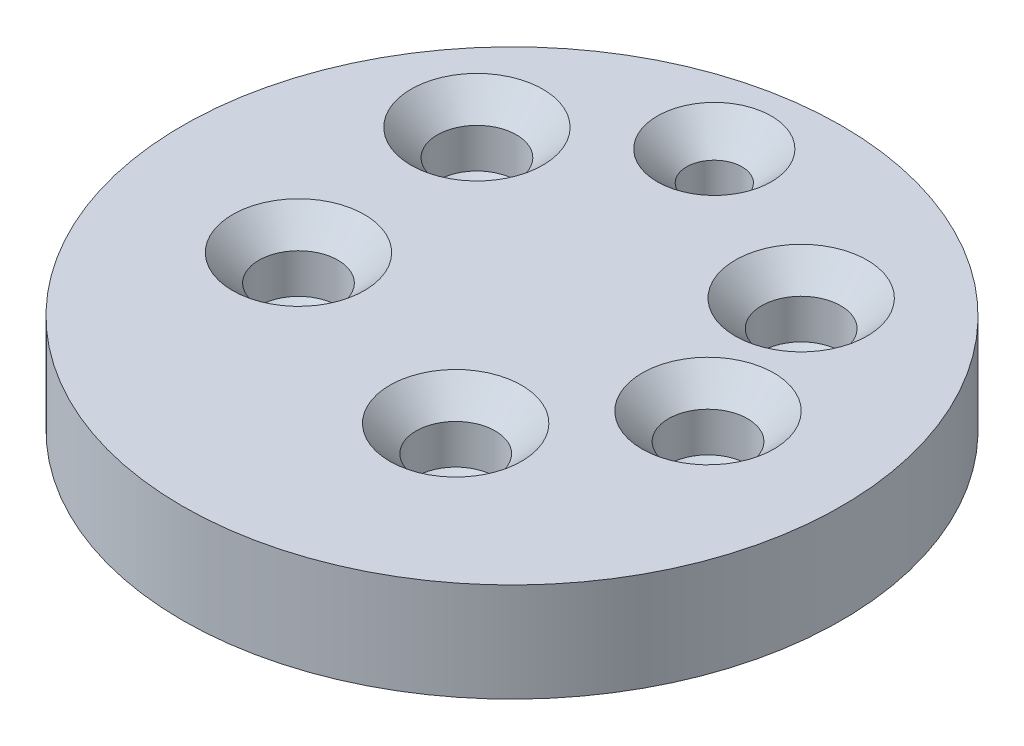
ISO-10303-21;
HEADER;
FILE_DESCRIPTION(('STEP AP214'),'2;1');
FILE_NAME('part.step','',(''),(''),'','','');
FILE_SCHEMA(('AUTOMOTIVE_DESIGN { 1 0 10303 214 1 1 1 1 }'));
ENDSEC;
DATA;
#1=APPLICATION_CONTEXT('core data for automotive mechanical design processes');
#2=APPLICATION_PROTOCOL_DEFINITION('international standard','automotive_design',2000,#1);
#3=PRODUCT_CONTEXT('',#1,'mechanical');
#4=PRODUCT('Part','Part','',(#3));
#5=PRODUCT_RELATED_PRODUCT_CATEGORY('part','',(#4));
#6=PRODUCT_DEFINITION_FORMATION('','',#4);
#7=PRODUCT_DEFINITION_CONTEXT('part definition',#1,'design');
#8=PRODUCT_DEFINITION('design','',#6,#7);
#9=PRODUCT_DEFINITION_SHAPE('','',#8);
#10=(LENGTH_UNIT() NAMED_UNIT(*) SI_UNIT(.MILLI.,.METRE.));
#11=(NAMED_UNIT(*) PLANE_ANGLE_UNIT() SI_UNIT($,.RADIAN.));
#12=(NAMED_UNIT(*) SI_UNIT($,.STERADIAN.) SOLID_ANGLE_UNIT());
#13=UNCERTAINTY_MEASURE_WITH_UNIT(LENGTH_MEASURE(1.E-05),#10,'distance_accuracy_value','');
#14=(GEOMETRIC_REPRESENTATION_CONTEXT(3) GLOBAL_UNCERTAINTY_ASSIGNED_CONTEXT((#13)) GLOBAL_UNIT_ASSIGNED_CONTEXT((#10,
#11,#12)) REPRESENTATION_CONTEXT('',''));
#15=CARTESIAN_POINT('',(0.,0.,0.));
#16=DIRECTION('',(0.,0.,1.));
#17=DIRECTION('',(1.,0.,0.));
#18=AXIS2_PLACEMENT_3D('',#15,#16,#17);
#19=CARTESIAN_POINT('',(0.,15.,0.));
#20=DIRECTION('',(0.,-1.,0.));
#21=DIRECTION('',(0.,0.,-1.));
#22=AXIS2_PLACEMENT_3D('',#19,#20,#21);
#23=CYLINDRICAL_SURFACE('',#22,50.);
#24=CARTESIAN_POINT('',(0.,15.,0.));
#25=DIRECTION('',(0.,1.,0.));
#26=DIRECTION('',(0.,0.,1.));
#27=AXIS2_PLACEMENT_3D('',#24,#25,#26);
#28=CIRCLE('',#27,50.);
#29=CARTESIAN_POINT('',(0.,15.,50.));
#30=VERTEX_POINT('',#29);
#31=EDGE_CURVE('E11',#30,#30,#28,.T.);
#32=ORIENTED_EDGE('',*,*,#31,.F.);
#33=EDGE_LOOP('',(#32));
#34=FACE_BOUND('',#33,.T.);
#35=CARTESIAN_POINT('',(0.,0.,0.));
#36=DIRECTION('',(0.,1.,0.));
#37=DIRECTION('',(0.,0.,1.));
#38=AXIS2_PLACEMENT_3D('',#35,#36,#37);
#39=CIRCLE('',#38,50.);
#40=CARTESIAN_POINT('',(0.,0.,50.));
#41=VERTEX_POINT('',#40);
#42=EDGE_CURVE('E36',#41,#41,#39,.T.);
#43=ORIENTED_EDGE('',*,*,#42,.T.);
#44=EDGE_LOOP('',(#43));
#45=FACE_BOUND('',#44,.T.);
#46=ADVANCED_FACE('F33',(#34,#45),#23,.T.);
#47=CARTESIAN_POINT('',(0.,15.,0.));
#48=DIRECTION('',(0.,1.,0.));
#49=DIRECTION('',(0.,0.,1.));
#50=AXIS2_PLACEMENT_3D('',#47,#48,#49);
#51=PLANE('',#50);
#52=CARTESIAN_POINT('',(-6.59663915831743,15.,-37.2911848599529));
#53=DIRECTION('',(0.,1.,0.));
#54=DIRECTION('',(0.,0.,1.));
#55=AXIS2_PLACEMENT_3D('',#52,#53,#54);
#56=CIRCLE('',#55,8.65);
#57=CARTESIAN_POINT('',(-6.59663915831743,15.,-28.6411848599529));
#58=VERTEX_POINT('',#57);
#59=EDGE_CURVE('E76',#58,#58,#56,.T.);
#60=ORIENTED_EDGE('',*,*,#59,.F.);
#61=EDGE_LOOP('',(#60));
#62=FACE_BOUND('',#61,.T.);
#63=CARTESIAN_POINT('',(-27.4586305144346,15.,-22.1361463713944));
#64=DIRECTION('',(0.,1.,0.));
#65=DIRECTION('',(0.,0.,1.));
#66=AXIS2_PLACEMENT_3D('',#63,#64,#65);
#67=CIRCLE('',#66,10.);
#68=CARTESIAN_POINT('',(-27.4586305144346,15.,-12.1361463713944));
#69=VERTEX_POINT('',#68);
#70=EDGE_CURVE('E69',#69,#69,#67,.T.);
#71=ORIENTED_EDGE('',*,*,#70,.F.);
#72=EDGE_LOOP('',(#71));
#73=FACE_BOUND('',#72,.T.);
#74=CARTESIAN_POINT('',(19.5936917504085,15.,-24.2811415810867));
#75=DIRECTION('',(0.,1.,0.));
#76=DIRECTION('',(0.,0.,1.));
#77=AXIS2_PLACEMENT_3D('',#74,#75,#76);
#78=CIRCLE('',#77,10.);
#79=CARTESIAN_POINT('',(19.5936917504085,15.,-14.2811415810867));
#80=VERTEX_POINT('',#79);
#81=EDGE_CURVE('E85',#80,#80,#78,.T.);
#82=ORIENTED_EDGE('',*,*,#81,.F.);
#83=EDGE_LOOP('',(#82));
#84=FACE_BOUND('',#83,.T.);
#85=CARTESIAN_POINT('',(-24.521924649477,15.,7.87276041841933));
#86=DIRECTION('',(0.,1.,0.));
#87=DIRECTION('',(0.,0.,1.));
#88=AXIS2_PLACEMENT_3D('',#85,#86,#87);
#89=CIRCLE('',#88,10.);
#90=CARTESIAN_POINT('',(-24.521924649477,15.,17.8727604184193));
#91=VERTEX_POINT('',#90);
#92=EDGE_CURVE('E94',#91,#91,#89,.T.);
#93=ORIENTED_EDGE('',*,*,#92,.F.);
#94=EDGE_LOOP('',(#93));
#95=FACE_BOUND('',#94,.T.);
#96=CARTESIAN_POINT('',(9.83243943768031,15.,18.376753365928));
#97=DIRECTION('',(0.,1.,0.));
#98=DIRECTION('',(0.,0.,1.));
#99=AXIS2_PLACEMENT_3D('',#96,#97,#98);
#100=CIRCLE('',#99,10.);
#101=CARTESIAN_POINT('',(9.83243943768031,15.,28.376753365928));
#102=VERTEX_POINT('',#101);
#103=EDGE_CURVE('E103',#102,#102,#100,.T.);
#104=ORIENTED_EDGE('',*,*,#103,.F.);
#105=EDGE_LOOP('',(#104));
#106=FACE_BOUND('',#105,.T.);
#107=CARTESIAN_POINT('',(27.3676852053022,15.,-2.3730949831704));
#108=DIRECTION('',(0.,1.,0.));
#109=DIRECTION('',(0.,0.,1.));
#110=AXIS2_PLACEMENT_3D('',#107,#108,#109);
#111=CIRCLE('',#110,10.);
#112=CARTESIAN_POINT('',(27.3676852053022,15.,7.6269050168296));
#113=VERTEX_POINT('',#112);
#114=EDGE_CURVE('E112',#113,#113,#111,.T.);
#115=ORIENTED_EDGE('',*,*,#114,.F.);
#116=EDGE_LOOP('',(#115));
#117=FACE_BOUND('',#116,.T.);
#118=ORIENTED_EDGE('',*,*,#31,.T.);
#119=EDGE_LOOP('',(#118));
#120=FACE_BOUND('',#119,.T.);
#121=ADVANCED_FACE('F129',(#62,#73,#84,#95,#106,#117,#120),#51,.T.);
#122=CARTESIAN_POINT('',(0.,0.,0.));
#123=DIRECTION('',(0.,1.,0.));
#124=DIRECTION('',(0.,0.,1.));
#125=AXIS2_PLACEMENT_3D('',#122,#123,#124);
#126=PLANE('',#125);
#127=ORIENTED_EDGE('',*,*,#42,.F.);
#128=EDGE_LOOP('',(#127));
#129=FACE_BOUND('',#128,.T.);
#130=ADVANCED_FACE('F126',(#129),#126,.F.);
#131=CARTESIAN_POINT('',(27.3676852053022,5.,-2.3730949831704));
#132=DIRECTION('',(0.,1.,0.));
#133=DIRECTION('',(0.,0.,1.));
#134=AXIS2_PLACEMENT_3D('',#131,#132,#133);
#135=CONICAL_SURFACE('',#134,6.,1.02974425867665);
#136=CARTESIAN_POINT('',(27.3676852053022,1.39483628583464,-2.3730949831704));
#137=VERTEX_POINT('',#136);
#138=VERTEX_LOOP('',#137);
#139=FACE_BOUND('',#138,.T.);
#140=CARTESIAN_POINT('',(27.3676852053022,5.,-2.3730949831704));
#141=DIRECTION('',(0.,1.,0.));
#142=DIRECTION('',(0.,0.,1.));
#143=AXIS2_PLACEMENT_3D('',#140,#141,#142);
#144=CIRCLE('',#143,6.);
#145=CARTESIAN_POINT('',(27.3676852053022,5.,3.6269050168296));
#146=VERTEX_POINT('',#145);
#147=EDGE_CURVE('E118',#146,#146,#144,.T.);
#148=ORIENTED_EDGE('',*,*,#147,.T.);
#149=EDGE_LOOP('',(#148));
#150=FACE_BOUND('',#149,.T.);
#151=ADVANCED_FACE('F128',(#139,#150),#135,.F.);
#152=CARTESIAN_POINT('',(27.3676852053022,15.,-2.3730949831704));
#153=DIRECTION('',(0.,1.,0.));
#154=DIRECTION('',(0.,0.,1.));
#155=AXIS2_PLACEMENT_3D('',#152,#153,#154);
#156=CYLINDRICAL_SURFACE('',#155,6.);
#157=ORIENTED_EDGE('',*,*,#147,.F.);
#158=EDGE_LOOP('',(#157));
#159=FACE_BOUND('',#158,.T.);
#160=CARTESIAN_POINT('',(27.3676852053022,11.,-2.3730949831704));
#161=DIRECTION('',(0.,1.,0.));
#162=DIRECTION('',(0.,0.,1.));
#163=AXIS2_PLACEMENT_3D('',#160,#161,#162);
#164=CIRCLE('',#163,6.);
#165=CARTESIAN_POINT('',(27.3676852053022,11.,3.6269050168296));
#166=VERTEX_POINT('',#165);
#167=EDGE_CURVE('E115',#166,#166,#164,.T.);
#168=ORIENTED_EDGE('',*,*,#167,.T.);
#169=EDGE_LOOP('',(#168));
#170=FACE_BOUND('',#169,.T.);
#171=ADVANCED_FACE('F134',(#159,#170),#156,.F.);
#172=CARTESIAN_POINT('',(27.3676852053022,15.,-2.3730949831704));
#173=DIRECTION('',(0.,1.,0.));
#174=DIRECTION('',(0.,0.,1.));
#175=AXIS2_PLACEMENT_3D('',#172,#173,#174);
#176=CONICAL_SURFACE('',#175,10.,0.785398163397449);
#177=ORIENTED_EDGE('',*,*,#167,.F.);
#178=EDGE_LOOP('',(#177));
#179=FACE_BOUND('',#178,.T.);
#180=ORIENTED_EDGE('',*,*,#114,.T.);
#181=EDGE_LOOP('',(#180));
#182=FACE_BOUND('',#181,.T.);
#183=ADVANCED_FACE('F230',(#179,#182),#176,.F.);
#184=CARTESIAN_POINT('',(9.83243943768031,5.,18.376753365928));
#185=DIRECTION('',(0.,1.,0.));
#186=DIRECTION('',(0.,0.,1.));
#187=AXIS2_PLACEMENT_3D('',#184,#185,#186);
#188=CONICAL_SURFACE('',#187,6.,1.02974425867665);
#189=CARTESIAN_POINT('',(9.8324394376803,1.39483628583464,18.376753365928));
#190=VERTEX_POINT('',#189);
#191=VERTEX_LOOP('',#190);
#192=FACE_BOUND('',#191,.T.);
#193=CARTESIAN_POINT('',(9.83243943768031,5.,18.376753365928));
#194=DIRECTION('',(0.,1.,0.));
#195=DIRECTION('',(0.,0.,1.));
#196=AXIS2_PLACEMENT_3D('',#193,#194,#195);
#197=CIRCLE('',#196,6.);
#198=CARTESIAN_POINT('',(9.83243943768031,5.,24.376753365928));
#199=VERTEX_POINT('',#198);
#200=EDGE_CURVE('E109',#199,#199,#197,.T.);
#201=ORIENTED_EDGE('',*,*,#200,.T.);
#202=EDGE_LOOP('',(#201));
#203=FACE_BOUND('',#202,.T.);
#204=ADVANCED_FACE('F226',(#192,#203),#188,.F.);
#205=CARTESIAN_POINT('',(9.83243943768031,15.,18.376753365928));
#206=DIRECTION('',(0.,1.,0.));
#207=DIRECTION('',(0.,0.,1.));
#208=AXIS2_PLACEMENT_3D('',#205,#206,#207);
#209=CYLINDRICAL_SURFACE('',#208,6.);
#210=ORIENTED_EDGE('',*,*,#200,.F.);
#211=EDGE_LOOP('',(#210));
#212=FACE_BOUND('',#211,.T.);
#213=CARTESIAN_POINT('',(9.83243943768031,11.,18.376753365928));
#214=DIRECTION('',(0.,1.,0.));
#215=DIRECTION('',(0.,0.,1.));
#216=AXIS2_PLACEMENT_3D('',#213,#214,#215);
#217=CIRCLE('',#216,6.);
#218=CARTESIAN_POINT('',(9.83243943768031,11.,24.376753365928));
#219=VERTEX_POINT('',#218);
#220=EDGE_CURVE('E106',#219,#219,#217,.T.);
#221=ORIENTED_EDGE('',*,*,#220,.T.);
#222=EDGE_LOOP('',(#221));
#223=FACE_BOUND('',#222,.T.);
#224=ADVANCED_FACE('F222',(#212,#223),#209,.F.);
#225=CARTESIAN_POINT('',(9.83243943768031,15.,18.376753365928));
#226=DIRECTION('',(0.,1.,0.));
#227=DIRECTION('',(0.,0.,1.));
#228=AXIS2_PLACEMENT_3D('',#225,#226,#227);
#229=CONICAL_SURFACE('',#228,10.,0.785398163397449);
#230=ORIENTED_EDGE('',*,*,#220,.F.);
#231=EDGE_LOOP('',(#230));
#232=FACE_BOUND('',#231,.T.);
#233=ORIENTED_EDGE('',*,*,#103,.T.);
#234=EDGE_LOOP('',(#233));
#235=FACE_BOUND('',#234,.T.);
#236=ADVANCED_FACE('F218',(#232,#235),#229,.F.);
#237=CARTESIAN_POINT('',(-24.521924649477,5.,7.87276041841933));
#238=DIRECTION('',(0.,1.,0.));
#239=DIRECTION('',(0.,0.,1.));
#240=AXIS2_PLACEMENT_3D('',#237,#238,#239);
#241=CONICAL_SURFACE('',#240,6.,1.02974425867665);
#242=CARTESIAN_POINT('',(-24.521924649477,1.39483628583464,7.87276041841933));
#243=VERTEX_POINT('',#242);
#244=VERTEX_LOOP('',#243);
#245=FACE_BOUND('',#244,.T.);
#246=CARTESIAN_POINT('',(-24.521924649477,5.,7.87276041841933));
#247=DIRECTION('',(0.,1.,0.));
#248=DIRECTION('',(0.,0.,1.));
#249=AXIS2_PLACEMENT_3D('',#246,#247,#248);
#250=CIRCLE('',#249,6.);
#251=CARTESIAN_POINT('',(-24.521924649477,5.,13.8727604184193));
#252=VERTEX_POINT('',#251);
#253=EDGE_CURVE('E100',#252,#252,#250,.T.);
#254=ORIENTED_EDGE('',*,*,#253,.T.);
#255=EDGE_LOOP('',(#254));
#256=FACE_BOUND('',#255,.T.);
#257=ADVANCED_FACE('F214',(#245,#256),#241,.F.);
#258=CARTESIAN_POINT('',(-24.521924649477,15.,7.87276041841933));
#259=DIRECTION('',(0.,1.,0.));
#260=DIRECTION('',(0.,0.,1.));
#261=AXIS2_PLACEMENT_3D('',#258,#259,#260);
#262=CYLINDRICAL_SURFACE('',#261,6.);
#263=ORIENTED_EDGE('',*,*,#253,.F.);
#264=EDGE_LOOP('',(#263));
#265=FACE_BOUND('',#264,.T.);
#266=CARTESIAN_POINT('',(-24.521924649477,11.,7.87276041841933));
#267=DIRECTION('',(0.,1.,0.));
#268=DIRECTION('',(0.,0.,1.));
#269=AXIS2_PLACEMENT_3D('',#266,#267,#268);
#270=CIRCLE('',#269,6.);
#271=CARTESIAN_POINT('',(-24.521924649477,11.,13.8727604184193));
#272=VERTEX_POINT('',#271);
#273=EDGE_CURVE('E97',#272,#272,#270,.T.);
#274=ORIENTED_EDGE('',*,*,#273,.T.);
#275=EDGE_LOOP('',(#274));
#276=FACE_BOUND('',#275,.T.);
#277=ADVANCED_FACE('F210',(#265,#276),#262,.F.);
#278=CARTESIAN_POINT('',(-24.521924649477,15.,7.87276041841933));
#279=DIRECTION('',(0.,1.,0.));
#280=DIRECTION('',(0.,0.,1.));
#281=AXIS2_PLACEMENT_3D('',#278,#279,#280);
#282=CONICAL_SURFACE('',#281,10.,0.785398163397449);
#283=ORIENTED_EDGE('',*,*,#273,.F.);
#284=EDGE_LOOP('',(#283));
#285=FACE_BOUND('',#284,.T.);
#286=ORIENTED_EDGE('',*,*,#92,.T.);
#287=EDGE_LOOP('',(#286));
#288=FACE_BOUND('',#287,.T.);
#289=ADVANCED_FACE('F206',(#285,#288),#282,.F.);
#290=CARTESIAN_POINT('',(19.5936917504085,5.,-24.2811415810867));
#291=DIRECTION('',(0.,1.,0.));
#292=DIRECTION('',(0.,0.,1.));
#293=AXIS2_PLACEMENT_3D('',#290,#291,#292);
#294=CONICAL_SURFACE('',#293,6.,1.02974425867665);
#295=CARTESIAN_POINT('',(19.5936917504085,1.39483628583464,-24.2811415810867));
#296=VERTEX_POINT('',#295);
#297=VERTEX_LOOP('',#296);
#298=FACE_BOUND('',#297,.T.);
#299=CARTESIAN_POINT('',(19.5936917504085,5.,-24.2811415810867));
#300=DIRECTION('',(0.,1.,0.));
#301=DIRECTION('',(0.,0.,1.));
#302=AXIS2_PLACEMENT_3D('',#299,#300,#301);
#303=CIRCLE('',#302,6.);
#304=CARTESIAN_POINT('',(19.5936917504085,5.,-18.2811415810867));
#305=VERTEX_POINT('',#304);
#306=EDGE_CURVE('E91',#305,#305,#303,.T.);
#307=ORIENTED_EDGE('',*,*,#306,.T.);
#308=EDGE_LOOP('',(#307));
#309=FACE_BOUND('',#308,.T.);
#310=ADVANCED_FACE('F202',(#298,#309),#294,.F.);
#311=CARTESIAN_POINT('',(19.5936917504085,15.,-24.2811415810867));
#312=DIRECTION('',(0.,1.,0.));
#313=DIRECTION('',(0.,0.,1.));
#314=AXIS2_PLACEMENT_3D('',#311,#312,#313);
#315=CYLINDRICAL_SURFACE('',#314,6.);
#316=ORIENTED_EDGE('',*,*,#306,.F.);
#317=EDGE_LOOP('',(#316));
#318=FACE_BOUND('',#317,.T.);
#319=CARTESIAN_POINT('',(19.5936917504085,11.,-24.2811415810867));
#320=DIRECTION('',(0.,1.,0.));
#321=DIRECTION('',(0.,0.,1.));
#322=AXIS2_PLACEMENT_3D('',#319,#320,#321);
#323=CIRCLE('',#322,6.);
#324=CARTESIAN_POINT('',(19.5936917504085,11.,-18.2811415810867));
#325=VERTEX_POINT('',#324);
#326=EDGE_CURVE('E88',#325,#325,#323,.T.);
#327=ORIENTED_EDGE('',*,*,#326,.T.);
#328=EDGE_LOOP('',(#327));
#329=FACE_BOUND('',#328,.T.);
#330=ADVANCED_FACE('F198',(#318,#329),#315,.F.);
#331=CARTESIAN_POINT('',(19.5936917504085,15.,-24.2811415810867));
#332=DIRECTION('',(0.,1.,0.));
#333=DIRECTION('',(0.,0.,1.));
#334=AXIS2_PLACEMENT_3D('',#331,#332,#333);
#335=CONICAL_SURFACE('',#334,10.,0.785398163397449);
#336=ORIENTED_EDGE('',*,*,#326,.F.);
#337=EDGE_LOOP('',(#336));
#338=FACE_BOUND('',#337,.T.);
#339=ORIENTED_EDGE('',*,*,#81,.T.);
#340=EDGE_LOOP('',(#339));
#341=FACE_BOUND('',#340,.T.);
#342=ADVANCED_FACE('F194',(#338,#341),#335,.F.);
#343=CARTESIAN_POINT('',(-27.4586305144346,5.,-22.1361463713944));
#344=DIRECTION('',(0.,1.,0.));
#345=DIRECTION('',(0.,0.,1.));
#346=AXIS2_PLACEMENT_3D('',#343,#344,#345);
#347=CONICAL_SURFACE('',#346,6.,1.02974425867665);
#348=CARTESIAN_POINT('',(-27.4586305144346,1.39483628583464,-22.1361463713944));
#349=VERTEX_POINT('',#348);
#350=VERTEX_LOOP('',#349);
#351=FACE_BOUND('',#350,.T.);
#352=CARTESIAN_POINT('',(-27.4586305144346,5.,-22.1361463713944));
#353=DIRECTION('',(0.,1.,0.));
#354=DIRECTION('',(0.,0.,1.));
#355=AXIS2_PLACEMENT_3D('',#352,#353,#354);
#356=CIRCLE('',#355,6.);
#357=CARTESIAN_POINT('',(-27.4586305144346,5.,-16.1361463713944));
#358=VERTEX_POINT('',#357);
#359=EDGE_CURVE('E82',#358,#358,#356,.T.);
#360=ORIENTED_EDGE('',*,*,#359,.T.);
#361=EDGE_LOOP('',(#360));
#362=FACE_BOUND('',#361,.T.);
#363=ADVANCED_FACE('F190',(#351,#362),#347,.F.);
#364=CARTESIAN_POINT('',(-27.4586305144346,15.,-22.1361463713944));
#365=DIRECTION('',(0.,1.,0.));
#366=DIRECTION('',(0.,0.,1.));
#367=AXIS2_PLACEMENT_3D('',#364,#365,#366);
#368=CYLINDRICAL_SURFACE('',#367,6.);
#369=ORIENTED_EDGE('',*,*,#359,.F.);
#370=EDGE_LOOP('',(#369));
#371=FACE_BOUND('',#370,.T.);
#372=CARTESIAN_POINT('',(-27.4586305144346,11.,-22.1361463713944));
#373=DIRECTION('',(0.,1.,0.));
#374=DIRECTION('',(0.,0.,1.));
#375=AXIS2_PLACEMENT_3D('',#372,#373,#374);
#376=CIRCLE('',#375,6.);
#377=CARTESIAN_POINT('',(-27.4586305144346,11.,-16.1361463713944));
#378=VERTEX_POINT('',#377);
#379=EDGE_CURVE('E73',#378,#378,#376,.T.);
#380=ORIENTED_EDGE('',*,*,#379,.T.);
#381=EDGE_LOOP('',(#380));
#382=FACE_BOUND('',#381,.T.);
#383=ADVANCED_FACE('F186',(#371,#382),#368,.F.);
#384=CARTESIAN_POINT('',(-27.4586305144346,15.,-22.1361463713944));
#385=DIRECTION('',(0.,1.,0.));
#386=DIRECTION('',(0.,0.,1.));
#387=AXIS2_PLACEMENT_3D('',#384,#385,#386);
#388=CONICAL_SURFACE('',#387,10.,0.785398163397449);
#389=ORIENTED_EDGE('',*,*,#379,.F.);
#390=EDGE_LOOP('',(#389));
#391=FACE_BOUND('',#390,.T.);
#392=ORIENTED_EDGE('',*,*,#70,.T.);
#393=EDGE_LOOP('',(#392));
#394=FACE_BOUND('',#393,.T.);
#395=ADVANCED_FACE('F63',(#391,#394),#388,.F.);
#396=CARTESIAN_POINT('',(-6.59663915831743,5.,-37.2911848599529));
#397=DIRECTION('',(0.,1.,0.));
#398=DIRECTION('',(0.,0.,1.));
#399=AXIS2_PLACEMENT_3D('',#396,#397,#398);
#400=CONICAL_SURFACE('',#399,4.2,1.02974425867665);
#401=CARTESIAN_POINT('',(-6.59663915831743,2.47638540008424,-37.2911848599529));
#402=VERTEX_POINT('',#401);
#403=VERTEX_LOOP('',#402);
#404=FACE_BOUND('',#403,.T.);
#405=CARTESIAN_POINT('',(-6.59663915831743,5.,-37.2911848599529));
#406=DIRECTION('',(0.,1.,0.));
#407=DIRECTION('',(0.,0.,1.));
#408=AXIS2_PLACEMENT_3D('',#405,#406,#407);
#409=CIRCLE('',#408,4.2);
#410=CARTESIAN_POINT('',(-6.59663915831743,5.,-33.0911848599529));
#411=VERTEX_POINT('',#410);
#412=EDGE_CURVE('E67',#411,#411,#409,.T.);
#413=ORIENTED_EDGE('',*,*,#412,.T.);
#414=EDGE_LOOP('',(#413));
#415=FACE_BOUND('',#414,.T.);
#416=ADVANCED_FACE('F59',(#404,#415),#400,.F.);
#417=CARTESIAN_POINT('',(-6.59663915831743,15.,-37.2911848599529));
#418=DIRECTION('',(0.,1.,0.));
#419=DIRECTION('',(0.,0.,1.));
#420=AXIS2_PLACEMENT_3D('',#417,#418,#419);
#421=CYLINDRICAL_SURFACE('',#420,4.2);
#422=ORIENTED_EDGE('',*,*,#412,.F.);
#423=EDGE_LOOP('',(#422));
#424=FACE_BOUND('',#423,.T.);
#425=CARTESIAN_POINT('',(-6.59663915831743,10.55,-37.2911848599529));
#426=DIRECTION('',(0.,1.,0.));
#427=DIRECTION('',(0.,0.,1.));
#428=AXIS2_PLACEMENT_3D('',#425,#426,#427);
#429=CIRCLE('',#428,4.2);
#430=CARTESIAN_POINT('',(-6.59663915831743,10.55,-33.0911848599529));
#431=VERTEX_POINT('',#430);
#432=EDGE_CURVE('E70',#431,#431,#429,.T.);
#433=ORIENTED_EDGE('',*,*,#432,.T.);
#434=EDGE_LOOP('',(#433));
#435=FACE_BOUND('',#434,.T.);
#436=ADVANCED_FACE('F62',(#424,#435),#421,.F.);
#437=CARTESIAN_POINT('',(-6.59663915831743,15.,-37.2911848599529));
#438=DIRECTION('',(0.,1.,0.));
#439=DIRECTION('',(0.,0.,1.));
#440=AXIS2_PLACEMENT_3D('',#437,#438,#439);
#441=CONICAL_SURFACE('',#440,8.65,0.785398163397449);
#442=ORIENTED_EDGE('',*,*,#432,.F.);
#443=EDGE_LOOP('',(#442));
#444=FACE_BOUND('',#443,.T.);
#445=ORIENTED_EDGE('',*,*,#59,.T.);
#446=EDGE_LOOP('',(#445));
#447=FACE_BOUND('',#446,.T.);
#448=ADVANCED_FACE('F169',(#444,#447),#441,.F.);
#449=CLOSED_SHELL('',(#46,#121,#130,#151,#171,#183,#204,#224,#236,#257,#277,#289,#310,#330,#342,
#363,#383,#395,#416,#436,#448));
#450=MANIFOLD_SOLID_BREP('B2',#449);
#451=ADVANCED_BREP_SHAPE_REPRESENTATION('',(#18,#450),#14);
#452=SHAPE_DEFINITION_REPRESENTATION(#9,#451);
ENDSEC;
END-ISO-10303-21;
